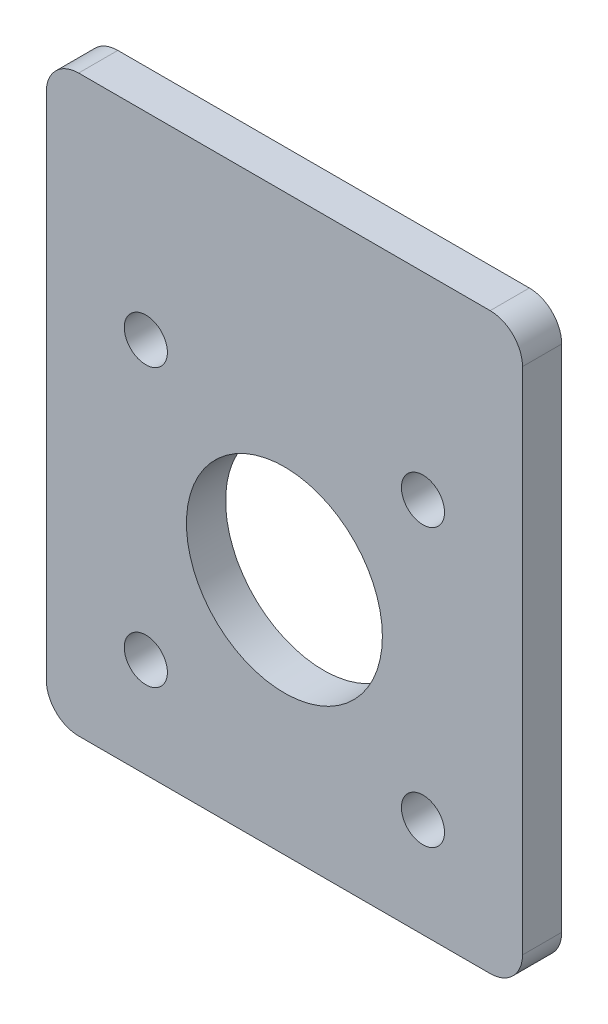
ISO-10303-21;
HEADER;
FILE_DESCRIPTION(('STEP AP214'),'2;1');
FILE_NAME('part.step','',(''),(''),'','','');
FILE_SCHEMA(('AUTOMOTIVE_DESIGN { 1 0 10303 214 1 1 1 1 }'));
ENDSEC;
DATA;
#1=APPLICATION_CONTEXT('core data for automotive mechanical design processes');
#2=APPLICATION_PROTOCOL_DEFINITION('international standard','automotive_design',2000,#1);
#3=PRODUCT_CONTEXT('',#1,'mechanical');
#4=PRODUCT('Part','Part','',(#3));
#5=PRODUCT_RELATED_PRODUCT_CATEGORY('part','',(#4));
#6=PRODUCT_DEFINITION_FORMATION('','',#4);
#7=PRODUCT_DEFINITION_CONTEXT('part definition',#1,'design');
#8=PRODUCT_DEFINITION('design','',#6,#7);
#9=PRODUCT_DEFINITION_SHAPE('','',#8);
#10=(LENGTH_UNIT() NAMED_UNIT(*) SI_UNIT(.MILLI.,.METRE.));
#11=(NAMED_UNIT(*) PLANE_ANGLE_UNIT() SI_UNIT($,.RADIAN.));
#12=(NAMED_UNIT(*) SI_UNIT($,.STERADIAN.) SOLID_ANGLE_UNIT());
#13=UNCERTAINTY_MEASURE_WITH_UNIT(LENGTH_MEASURE(1.E-05),#10,'distance_accuracy_value','');
#14=(GEOMETRIC_REPRESENTATION_CONTEXT(3) GLOBAL_UNCERTAINTY_ASSIGNED_CONTEXT((#13)) GLOBAL_UNIT_ASSIGNED_CONTEXT((#10,
#11,#12)) REPRESENTATION_CONTEXT('',''));
#15=CARTESIAN_POINT('',(0.,0.,0.));
#16=DIRECTION('',(0.,0.,1.));
#17=DIRECTION('',(1.,0.,0.));
#18=AXIS2_PLACEMENT_3D('',#15,#16,#17);
#19=CARTESIAN_POINT('',(-16.5432189845748,4.01167470132761,2.));
#20=DIRECTION('',(0.,0.,1.));
#21=DIRECTION('',(1.,0.,0.));
#22=AXIS2_PLACEMENT_3D('',#19,#20,#21);
#23=PLANE('',#22);
#24=CARTESIAN_POINT('',(-13.1142867964402,-4.41725748680701,2.));
#25=DIRECTION('',(0.,0.,1.));
#26=DIRECTION('',(1.,0.,0.));
#27=AXIS2_PLACEMENT_3D('',#24,#25,#26);
#28=CIRCLE('',#27,1.1);
#29=CARTESIAN_POINT('',(-12.0142867964402,-4.41725748680701,2.));
#30=VERTEX_POINT('',#29);
#31=EDGE_CURVE('E148',#30,#30,#28,.T.);
#32=ORIENTED_EDGE('',*,*,#31,.F.);
#33=EDGE_LOOP('',(#32));
#34=FACE_BOUND('',#33,.T.);
#35=CARTESIAN_POINT('',(1.02784882729082,-18.5593931105379,2.));
#36=DIRECTION('',(0.,0.,1.));
#37=DIRECTION('',(1.,0.,0.));
#38=AXIS2_PLACEMENT_3D('',#35,#36,#37);
#39=CIRCLE('',#38,1.1);
#40=CARTESIAN_POINT('',(2.12784882729082,-18.5593931105379,2.));
#41=VERTEX_POINT('',#40);
#42=EDGE_CURVE('E162',#41,#41,#39,.T.);
#43=ORIENTED_EDGE('',*,*,#42,.F.);
#44=EDGE_LOOP('',(#43));
#45=FACE_BOUND('',#44,.T.);
#46=CARTESIAN_POINT('',(1.02784882729071,-4.41725748680696,2.));
#47=DIRECTION('',(0.,0.,1.));
#48=DIRECTION('',(1.,0.,0.));
#49=AXIS2_PLACEMENT_3D('',#46,#47,#48);
#50=CIRCLE('',#49,1.1);
#51=CARTESIAN_POINT('',(2.12784882729071,-4.41725748680696,2.));
#52=VERTEX_POINT('',#51);
#53=EDGE_CURVE('E11',#52,#52,#50,.T.);
#54=ORIENTED_EDGE('',*,*,#53,.F.);
#55=EDGE_LOOP('',(#54));
#56=FACE_BOUND('',#55,.T.);
#57=CARTESIAN_POINT('',(-13.1142867964418,-18.5593931105363,2.));
#58=DIRECTION('',(0.,0.,1.));
#59=DIRECTION('',(1.,0.,0.));
#60=AXIS2_PLACEMENT_3D('',#57,#58,#59);
#61=CIRCLE('',#60,1.10000000000111);
#62=CARTESIAN_POINT('',(-12.0142867964407,-18.5593931105363,2.));
#63=VERTEX_POINT('',#62);
#64=EDGE_CURVE('E168',#63,#63,#61,.T.);
#65=ORIENTED_EDGE('',*,*,#64,.F.);
#66=EDGE_LOOP('',(#65));
#67=FACE_BOUND('',#66,.T.);
#68=CARTESIAN_POINT('',(-6.0432189845748,-11.4883252986724,2.));
#69=DIRECTION('',(0.,0.,1.));
#70=DIRECTION('',(1.,0.,0.));
#71=AXIS2_PLACEMENT_3D('',#68,#69,#70);
#72=CIRCLE('',#71,5.);
#73=CARTESIAN_POINT('',(-1.0432189845748,-11.4883252986724,2.));
#74=VERTEX_POINT('',#73);
#75=EDGE_CURVE('E156',#74,#74,#72,.T.);
#76=ORIENTED_EDGE('',*,*,#75,.F.);
#77=EDGE_LOOP('',(#76));
#78=FACE_BOUND('',#77,.T.);
#79=CARTESIAN_POINT('',(-16.5432189845748,4.01167470132761,2.));
#80=DIRECTION('',(0.,0.,1.));
#81=DIRECTION('',(1.,0.,0.));
#82=AXIS2_PLACEMENT_3D('',#79,#80,#81);
#83=CIRCLE('',#82,1.65);
#84=CARTESIAN_POINT('',(-16.5432189845748,5.66167470132761,2.));
#85=VERTEX_POINT('',#84);
#86=CARTESIAN_POINT('',(-18.1932189845748,4.01167470132761,2.));
#87=VERTEX_POINT('',#86);
#88=EDGE_CURVE('E118',#85,#87,#83,.T.);
#89=ORIENTED_EDGE('',*,*,#88,.T.);
#90=DIRECTION('',(0.,-1.,0.));
#91=VECTOR('',#90,1.);
#92=CARTESIAN_POINT('',(-18.1932189845748,4.01167470132761,2.));
#93=LINE('',#92,#91);
#94=CARTESIAN_POINT('',(-18.1932189845748,-21.9883252986724,2.));
#95=VERTEX_POINT('',#94);
#96=EDGE_CURVE('E48',#87,#95,#93,.T.);
#97=ORIENTED_EDGE('',*,*,#96,.T.);
#98=CARTESIAN_POINT('',(-16.5432189845748,-21.9883252986724,2.));
#99=DIRECTION('',(0.,0.,1.));
#100=DIRECTION('',(1.,0.,0.));
#101=AXIS2_PLACEMENT_3D('',#98,#99,#100);
#102=CIRCLE('',#101,1.65);
#103=CARTESIAN_POINT('',(-16.5432189845748,-23.6383252986724,2.));
#104=VERTEX_POINT('',#103);
#105=EDGE_CURVE('E108',#95,#104,#102,.T.);
#106=ORIENTED_EDGE('',*,*,#105,.T.);
#107=DIRECTION('',(1.,0.,0.));
#108=VECTOR('',#107,1.);
#109=CARTESIAN_POINT('',(-16.5432189845748,-23.6383252986724,2.));
#110=LINE('',#109,#108);
#111=CARTESIAN_POINT('',(4.45678101542519,-23.6383252986724,2.));
#112=VERTEX_POINT('',#111);
#113=EDGE_CURVE('E114',#104,#112,#110,.T.);
#114=ORIENTED_EDGE('',*,*,#113,.T.);
#115=CARTESIAN_POINT('',(4.45678101542519,-21.9883252986724,2.));
#116=DIRECTION('',(0.,0.,1.));
#117=DIRECTION('',(1.,0.,0.));
#118=AXIS2_PLACEMENT_3D('',#115,#116,#117);
#119=CIRCLE('',#118,1.65);
#120=CARTESIAN_POINT('',(6.10678101542519,-21.9883252986724,2.));
#121=VERTEX_POINT('',#120);
#122=EDGE_CURVE('E124',#112,#121,#119,.T.);
#123=ORIENTED_EDGE('',*,*,#122,.T.);
#124=DIRECTION('',(0.,1.,0.));
#125=VECTOR('',#124,1.);
#126=CARTESIAN_POINT('',(6.10678101542519,-21.9883252986724,2.));
#127=LINE('',#126,#125);
#128=CARTESIAN_POINT('',(6.10678101542518,4.01167470132761,2.));
#129=VERTEX_POINT('',#128);
#130=EDGE_CURVE('E127',#121,#129,#127,.T.);
#131=ORIENTED_EDGE('',*,*,#130,.T.);
#132=CARTESIAN_POINT('',(4.45678101542518,4.01167470132761,2.));
#133=DIRECTION('',(0.,0.,1.));
#134=DIRECTION('',(1.,0.,0.));
#135=AXIS2_PLACEMENT_3D('',#132,#133,#134);
#136=CIRCLE('',#135,1.65);
#137=CARTESIAN_POINT('',(4.45678101542518,5.66167470132761,2.));
#138=VERTEX_POINT('',#137);
#139=EDGE_CURVE('E130',#129,#138,#136,.T.);
#140=ORIENTED_EDGE('',*,*,#139,.T.);
#141=DIRECTION('',(-1.,0.,0.));
#142=VECTOR('',#141,1.);
#143=CARTESIAN_POINT('',(4.45678101542518,5.66167470132761,2.));
#144=LINE('',#143,#142);
#145=EDGE_CURVE('E133',#138,#85,#144,.T.);
#146=ORIENTED_EDGE('',*,*,#145,.T.);
#147=EDGE_LOOP('',(#89,#97,#106,#114,#123,#131,#140,#146));
#148=FACE_BOUND('',#147,.T.);
#149=ADVANCED_FACE('F33',(#34,#45,#56,#67,#78,#148),#23,.T.);
#150=CARTESIAN_POINT('',(-16.5432189845748,4.01167470132761,0.));
#151=DIRECTION('',(0.,0.,1.));
#152=DIRECTION('',(1.,0.,0.));
#153=AXIS2_PLACEMENT_3D('',#150,#151,#152);
#154=PLANE('',#153);
#155=CARTESIAN_POINT('',(-13.1142867964402,-4.41725748680701,0.));
#156=DIRECTION('',(0.,0.,1.));
#157=DIRECTION('',(1.,0.,0.));
#158=AXIS2_PLACEMENT_3D('',#155,#156,#157);
#159=CIRCLE('',#158,1.1);
#160=CARTESIAN_POINT('',(-12.0142867964402,-4.41725748680701,0.));
#161=VERTEX_POINT('',#160);
#162=EDGE_CURVE('E152',#161,#161,#159,.T.);
#163=ORIENTED_EDGE('',*,*,#162,.T.);
#164=EDGE_LOOP('',(#163));
#165=FACE_BOUND('',#164,.T.);
#166=CARTESIAN_POINT('',(-6.0432189845748,-11.4883252986724,0.));
#167=DIRECTION('',(0.,0.,1.));
#168=DIRECTION('',(1.,0.,0.));
#169=AXIS2_PLACEMENT_3D('',#166,#167,#168);
#170=CIRCLE('',#169,5.);
#171=CARTESIAN_POINT('',(-1.0432189845748,-11.4883252986724,0.));
#172=VERTEX_POINT('',#171);
#173=EDGE_CURVE('E151',#172,#172,#170,.T.);
#174=ORIENTED_EDGE('',*,*,#173,.T.);
#175=EDGE_LOOP('',(#174));
#176=FACE_BOUND('',#175,.T.);
#177=CARTESIAN_POINT('',(1.02784882729082,-18.5593931105379,0.));
#178=DIRECTION('',(0.,0.,1.));
#179=DIRECTION('',(1.,0.,0.));
#180=AXIS2_PLACEMENT_3D('',#177,#178,#179);
#181=CIRCLE('',#180,1.1);
#182=CARTESIAN_POINT('',(2.12784882729082,-18.5593931105379,0.));
#183=VERTEX_POINT('',#182);
#184=EDGE_CURVE('E159',#183,#183,#181,.T.);
#185=ORIENTED_EDGE('',*,*,#184,.T.);
#186=EDGE_LOOP('',(#185));
#187=FACE_BOUND('',#186,.T.);
#188=CARTESIAN_POINT('',(-13.1142867964418,-18.5593931105363,0.));
#189=DIRECTION('',(0.,0.,1.));
#190=DIRECTION('',(1.,0.,0.));
#191=AXIS2_PLACEMENT_3D('',#188,#189,#190);
#192=CIRCLE('',#191,1.10000000000111);
#193=CARTESIAN_POINT('',(-12.0142867964407,-18.5593931105363,0.));
#194=VERTEX_POINT('',#193);
#195=EDGE_CURVE('E165',#194,#194,#192,.T.);
#196=ORIENTED_EDGE('',*,*,#195,.T.);
#197=EDGE_LOOP('',(#196));
#198=FACE_BOUND('',#197,.T.);
#199=CARTESIAN_POINT('',(1.02784882729071,-4.41725748680696,0.));
#200=DIRECTION('',(0.,0.,1.));
#201=DIRECTION('',(1.,0.,0.));
#202=AXIS2_PLACEMENT_3D('',#199,#200,#201);
#203=CIRCLE('',#202,1.1);
#204=CARTESIAN_POINT('',(2.12784882729071,-4.41725748680696,0.));
#205=VERTEX_POINT('',#204);
#206=EDGE_CURVE('E37',#205,#205,#203,.T.);
#207=ORIENTED_EDGE('',*,*,#206,.T.);
#208=EDGE_LOOP('',(#207));
#209=FACE_BOUND('',#208,.T.);
#210=DIRECTION('',(0.,1.,0.));
#211=VECTOR('',#210,1.);
#212=CARTESIAN_POINT('',(-18.1932189845748,4.01167470132761,0.));
#213=LINE('',#212,#211);
#214=CARTESIAN_POINT('',(-18.1932189845748,-21.9883252986724,0.));
#215=VERTEX_POINT('',#214);
#216=CARTESIAN_POINT('',(-18.1932189845748,4.01167470132761,0.));
#217=VERTEX_POINT('',#216);
#218=EDGE_CURVE('E101',#215,#217,#213,.T.);
#219=ORIENTED_EDGE('',*,*,#218,.T.);
#220=CARTESIAN_POINT('',(-16.5432189845748,4.01167470132761,0.));
#221=DIRECTION('',(0.,0.,1.));
#222=DIRECTION('',(1.,0.,0.));
#223=AXIS2_PLACEMENT_3D('',#220,#221,#222);
#224=CIRCLE('',#223,1.65);
#225=CARTESIAN_POINT('',(-16.5432189845748,5.66167470132761,0.));
#226=VERTEX_POINT('',#225);
#227=EDGE_CURVE('E147',#217,#226,#224,.F.);
#228=ORIENTED_EDGE('',*,*,#227,.T.);
#229=DIRECTION('',(1.,0.,0.));
#230=VECTOR('',#229,1.);
#231=CARTESIAN_POINT('',(4.45678101542518,5.66167470132761,0.));
#232=LINE('',#231,#230);
#233=CARTESIAN_POINT('',(4.45678101542518,5.66167470132761,0.));
#234=VERTEX_POINT('',#233);
#235=EDGE_CURVE('E253',#226,#234,#232,.T.);
#236=ORIENTED_EDGE('',*,*,#235,.T.);
#237=CARTESIAN_POINT('',(4.45678101542518,4.01167470132761,0.));
#238=DIRECTION('',(0.,0.,1.));
#239=DIRECTION('',(1.,0.,0.));
#240=AXIS2_PLACEMENT_3D('',#237,#238,#239);
#241=CIRCLE('',#240,1.65);
#242=CARTESIAN_POINT('',(6.10678101542518,4.0116747013276,0.));
#243=VERTEX_POINT('',#242);
#244=EDGE_CURVE('E259',#234,#243,#241,.F.);
#245=ORIENTED_EDGE('',*,*,#244,.T.);
#246=DIRECTION('',(0.,-1.,0.));
#247=VECTOR('',#246,1.);
#248=CARTESIAN_POINT('',(6.10678101542519,-21.9883252986724,0.));
#249=LINE('',#248,#247);
#250=CARTESIAN_POINT('',(6.10678101542519,-21.9883252986724,0.));
#251=VERTEX_POINT('',#250);
#252=EDGE_CURVE('E263',#243,#251,#249,.T.);
#253=ORIENTED_EDGE('',*,*,#252,.T.);
#254=CARTESIAN_POINT('',(4.45678101542519,-21.9883252986724,0.));
#255=DIRECTION('',(0.,0.,1.));
#256=DIRECTION('',(1.,0.,0.));
#257=AXIS2_PLACEMENT_3D('',#254,#255,#256);
#258=CIRCLE('',#257,1.65);
#259=CARTESIAN_POINT('',(4.45678101542519,-23.6383252986724,0.));
#260=VERTEX_POINT('',#259);
#261=EDGE_CURVE('E267',#251,#260,#258,.F.);
#262=ORIENTED_EDGE('',*,*,#261,.T.);
#263=DIRECTION('',(-1.,0.,0.));
#264=VECTOR('',#263,1.);
#265=CARTESIAN_POINT('',(-16.5432189845748,-23.6383252986724,0.));
#266=LINE('',#265,#264);
#267=CARTESIAN_POINT('',(-16.5432189845748,-23.6383252986724,0.));
#268=VERTEX_POINT('',#267);
#269=EDGE_CURVE('E270',#260,#268,#266,.T.);
#270=ORIENTED_EDGE('',*,*,#269,.T.);
#271=CARTESIAN_POINT('',(-16.5432189845748,-21.9883252986724,0.));
#272=DIRECTION('',(0.,0.,1.));
#273=DIRECTION('',(1.,0.,0.));
#274=AXIS2_PLACEMENT_3D('',#271,#272,#273);
#275=CIRCLE('',#274,1.65);
#276=EDGE_CURVE('E155',#268,#215,#275,.F.);
#277=ORIENTED_EDGE('',*,*,#276,.T.);
#278=EDGE_LOOP('',(#219,#228,#236,#245,#253,#262,#270,#277));
#279=FACE_BOUND('',#278,.T.);
#280=ADVANCED_FACE('F35',(#165,#176,#187,#198,#209,#279),#154,.F.);
#281=CARTESIAN_POINT('',(1.02784882729071,-4.41725748680696,2.));
#282=DIRECTION('',(0.,0.,-1.));
#283=DIRECTION('',(-1.,0.,0.));
#284=AXIS2_PLACEMENT_3D('',#281,#282,#283);
#285=CYLINDRICAL_SURFACE('',#284,1.1);
#286=ORIENTED_EDGE('',*,*,#53,.T.);
#287=EDGE_LOOP('',(#286));
#288=FACE_BOUND('',#287,.T.);
#289=ORIENTED_EDGE('',*,*,#206,.F.);
#290=EDGE_LOOP('',(#289));
#291=FACE_BOUND('',#290,.T.);
#292=ADVANCED_FACE('F179',(#288,#291),#285,.F.);
#293=CARTESIAN_POINT('',(-13.1142867964418,-18.5593931105363,2.));
#294=DIRECTION('',(0.,0.,-1.));
#295=DIRECTION('',(-1.,0.,0.));
#296=AXIS2_PLACEMENT_3D('',#293,#294,#295);
#297=CYLINDRICAL_SURFACE('',#296,1.10000000000111);
#298=ORIENTED_EDGE('',*,*,#64,.T.);
#299=EDGE_LOOP('',(#298));
#300=FACE_BOUND('',#299,.T.);
#301=ORIENTED_EDGE('',*,*,#195,.F.);
#302=EDGE_LOOP('',(#301));
#303=FACE_BOUND('',#302,.T.);
#304=ADVANCED_FACE('F176',(#300,#303),#297,.F.);
#305=CARTESIAN_POINT('',(1.02784882729082,-18.5593931105379,2.));
#306=DIRECTION('',(0.,0.,-1.));
#307=DIRECTION('',(-1.,0.,0.));
#308=AXIS2_PLACEMENT_3D('',#305,#306,#307);
#309=CYLINDRICAL_SURFACE('',#308,1.1);
#310=ORIENTED_EDGE('',*,*,#42,.T.);
#311=EDGE_LOOP('',(#310));
#312=FACE_BOUND('',#311,.T.);
#313=ORIENTED_EDGE('',*,*,#184,.F.);
#314=EDGE_LOOP('',(#313));
#315=FACE_BOUND('',#314,.T.);
#316=ADVANCED_FACE('F178',(#312,#315),#309,.F.);
#317=CARTESIAN_POINT('',(-6.0432189845748,-11.4883252986724,2.));
#318=DIRECTION('',(0.,0.,-1.));
#319=DIRECTION('',(-1.,0.,0.));
#320=AXIS2_PLACEMENT_3D('',#317,#318,#319);
#321=CYLINDRICAL_SURFACE('',#320,5.);
#322=ORIENTED_EDGE('',*,*,#75,.T.);
#323=EDGE_LOOP('',(#322));
#324=FACE_BOUND('',#323,.T.);
#325=ORIENTED_EDGE('',*,*,#173,.F.);
#326=EDGE_LOOP('',(#325));
#327=FACE_BOUND('',#326,.T.);
#328=ADVANCED_FACE('F186',(#324,#327),#321,.F.);
#329=CARTESIAN_POINT('',(-13.1142867964402,-4.41725748680701,2.));
#330=DIRECTION('',(0.,0.,-1.));
#331=DIRECTION('',(-1.,0.,0.));
#332=AXIS2_PLACEMENT_3D('',#329,#330,#331);
#333=CYLINDRICAL_SURFACE('',#332,1.1);
#334=ORIENTED_EDGE('',*,*,#31,.T.);
#335=EDGE_LOOP('',(#334));
#336=FACE_BOUND('',#335,.T.);
#337=ORIENTED_EDGE('',*,*,#162,.F.);
#338=EDGE_LOOP('',(#337));
#339=FACE_BOUND('',#338,.T.);
#340=ADVANCED_FACE('F209',(#336,#339),#333,.F.);
#341=CARTESIAN_POINT('',(-18.1932189845748,4.01167470132761,-39.0512483795333));
#342=DIRECTION('',(-1.,0.,0.));
#343=DIRECTION('',(0.,0.,1.));
#344=AXIS2_PLACEMENT_3D('',#341,#342,#343);
#345=PLANE('',#344);
#346=DIRECTION('',(0.,0.,1.));
#347=VECTOR('',#346,1.);
#348=CARTESIAN_POINT('',(-18.1932189845748,-21.9883252986724,-39.0512483795333));
#349=LINE('',#348,#347);
#350=EDGE_CURVE('E97',#215,#95,#349,.T.);
#351=ORIENTED_EDGE('',*,*,#350,.T.);
#352=ORIENTED_EDGE('',*,*,#96,.F.);
#353=DIRECTION('',(0.,0.,1.));
#354=VECTOR('',#353,1.);
#355=CARTESIAN_POINT('',(-18.1932189845748,4.01167470132761,-39.0512483795333));
#356=LINE('',#355,#354);
#357=EDGE_CURVE('E105',#217,#87,#356,.T.);
#358=ORIENTED_EDGE('',*,*,#357,.F.);
#359=ORIENTED_EDGE('',*,*,#218,.F.);
#360=EDGE_LOOP('',(#351,#352,#358,#359));
#361=FACE_BOUND('',#360,.T.);
#362=ADVANCED_FACE('F99',(#361),#345,.T.);
#363=CARTESIAN_POINT('',(-16.5432189845748,-21.9883252986724,-39.0512483795333));
#364=DIRECTION('',(0.,0.,1.));
#365=DIRECTION('',(1.,0.,0.));
#366=AXIS2_PLACEMENT_3D('',#363,#364,#365);
#367=CYLINDRICAL_SURFACE('',#366,1.65);
#368=DIRECTION('',(0.,0.,1.));
#369=VECTOR('',#368,1.);
#370=CARTESIAN_POINT('',(-16.5432189845748,-23.6383252986724,-39.0512483795333));
#371=LINE('',#370,#369);
#372=EDGE_CURVE('E104',#268,#104,#371,.T.);
#373=ORIENTED_EDGE('',*,*,#372,.T.);
#374=ORIENTED_EDGE('',*,*,#105,.F.);
#375=ORIENTED_EDGE('',*,*,#350,.F.);
#376=ORIENTED_EDGE('',*,*,#276,.F.);
#377=EDGE_LOOP('',(#373,#374,#375,#376));
#378=FACE_BOUND('',#377,.T.);
#379=ADVANCED_FACE('F109',(#378),#367,.T.);
#380=CARTESIAN_POINT('',(-16.5432189845748,-23.6383252986724,-39.0512483795333));
#381=DIRECTION('',(0.,-1.,0.));
#382=DIRECTION('',(1.,0.,0.));
#383=AXIS2_PLACEMENT_3D('',#380,#381,#382);
#384=PLANE('',#383);
#385=DIRECTION('',(0.,0.,1.));
#386=VECTOR('',#385,1.);
#387=CARTESIAN_POINT('',(4.45678101542519,-23.6383252986724,-39.0512483795333));
#388=LINE('',#387,#386);
#389=EDGE_CURVE('E142',#260,#112,#388,.T.);
#390=ORIENTED_EDGE('',*,*,#389,.T.);
#391=ORIENTED_EDGE('',*,*,#113,.F.);
#392=ORIENTED_EDGE('',*,*,#372,.F.);
#393=ORIENTED_EDGE('',*,*,#269,.F.);
#394=EDGE_LOOP('',(#390,#391,#392,#393));
#395=FACE_BOUND('',#394,.T.);
#396=ADVANCED_FACE('F230',(#395),#384,.T.);
#397=CARTESIAN_POINT('',(4.45678101542519,-21.9883252986724,-39.0512483795333));
#398=DIRECTION('',(0.,0.,1.));
#399=DIRECTION('',(1.,0.,0.));
#400=AXIS2_PLACEMENT_3D('',#397,#398,#399);
#401=CYLINDRICAL_SURFACE('',#400,1.65);
#402=DIRECTION('',(0.,0.,1.));
#403=VECTOR('',#402,1.);
#404=CARTESIAN_POINT('',(6.10678101542519,-21.9883252986724,-39.0512483795333));
#405=LINE('',#404,#403);
#406=EDGE_CURVE('E140',#251,#121,#405,.T.);
#407=ORIENTED_EDGE('',*,*,#406,.T.);
#408=ORIENTED_EDGE('',*,*,#122,.F.);
#409=ORIENTED_EDGE('',*,*,#389,.F.);
#410=ORIENTED_EDGE('',*,*,#261,.F.);
#411=EDGE_LOOP('',(#407,#408,#409,#410));
#412=FACE_BOUND('',#411,.T.);
#413=ADVANCED_FACE('F233',(#412),#401,.T.);
#414=CARTESIAN_POINT('',(6.10678101542519,-21.9883252986724,-39.0512483795333));
#415=DIRECTION('',(1.,0.,0.));
#416=DIRECTION('',(0.,1.,0.));
#417=AXIS2_PLACEMENT_3D('',#414,#415,#416);
#418=PLANE('',#417);
#419=DIRECTION('',(0.,0.,1.));
#420=VECTOR('',#419,1.);
#421=CARTESIAN_POINT('',(6.10678101542518,4.01167470132761,-39.0512483795333));
#422=LINE('',#421,#420);
#423=EDGE_CURVE('E138',#243,#129,#422,.T.);
#424=ORIENTED_EDGE('',*,*,#423,.T.);
#425=ORIENTED_EDGE('',*,*,#130,.F.);
#426=ORIENTED_EDGE('',*,*,#406,.F.);
#427=ORIENTED_EDGE('',*,*,#252,.F.);
#428=EDGE_LOOP('',(#424,#425,#426,#427));
#429=FACE_BOUND('',#428,.T.);
#430=ADVANCED_FACE('F237',(#429),#418,.T.);
#431=CARTESIAN_POINT('',(4.45678101542518,4.01167470132761,-39.0512483795333));
#432=DIRECTION('',(0.,0.,1.));
#433=DIRECTION('',(1.,0.,0.));
#434=AXIS2_PLACEMENT_3D('',#431,#432,#433);
#435=CYLINDRICAL_SURFACE('',#434,1.65);
#436=DIRECTION('',(0.,0.,1.));
#437=VECTOR('',#436,1.);
#438=CARTESIAN_POINT('',(4.45678101542518,5.66167470132761,-39.0512483795333));
#439=LINE('',#438,#437);
#440=EDGE_CURVE('E136',#234,#138,#439,.T.);
#441=ORIENTED_EDGE('',*,*,#440,.T.);
#442=ORIENTED_EDGE('',*,*,#139,.F.);
#443=ORIENTED_EDGE('',*,*,#423,.F.);
#444=ORIENTED_EDGE('',*,*,#244,.F.);
#445=EDGE_LOOP('',(#441,#442,#443,#444));
#446=FACE_BOUND('',#445,.T.);
#447=ADVANCED_FACE('F241',(#446),#435,.T.);
#448=CARTESIAN_POINT('',(4.45678101542518,5.66167470132761,-39.0512483795333));
#449=DIRECTION('',(0.,1.,0.));
#450=DIRECTION('',(0.,0.,1.));
#451=AXIS2_PLACEMENT_3D('',#448,#449,#450);
#452=PLANE('',#451);
#453=DIRECTION('',(0.,0.,1.));
#454=VECTOR('',#453,1.);
#455=CARTESIAN_POINT('',(-16.5432189845748,5.66167470132761,-39.0512483795333));
#456=LINE('',#455,#454);
#457=EDGE_CURVE('E56',#226,#85,#456,.T.);
#458=ORIENTED_EDGE('',*,*,#457,.T.);
#459=ORIENTED_EDGE('',*,*,#145,.F.);
#460=ORIENTED_EDGE('',*,*,#440,.F.);
#461=ORIENTED_EDGE('',*,*,#235,.F.);
#462=EDGE_LOOP('',(#458,#459,#460,#461));
#463=FACE_BOUND('',#462,.T.);
#464=ADVANCED_FACE('F225',(#463),#452,.T.);
#465=CARTESIAN_POINT('',(-16.5432189845748,4.01167470132761,-39.0512483795333));
#466=DIRECTION('',(0.,0.,1.));
#467=DIRECTION('',(1.,0.,0.));
#468=AXIS2_PLACEMENT_3D('',#465,#466,#467);
#469=CYLINDRICAL_SURFACE('',#468,1.65);
#470=ORIENTED_EDGE('',*,*,#357,.T.);
#471=ORIENTED_EDGE('',*,*,#88,.F.);
#472=ORIENTED_EDGE('',*,*,#457,.F.);
#473=ORIENTED_EDGE('',*,*,#227,.F.);
#474=EDGE_LOOP('',(#470,#471,#472,#473));
#475=FACE_BOUND('',#474,.T.);
#476=ADVANCED_FACE('F222',(#475),#469,.T.);
#477=CLOSED_SHELL('',(#149,#280,#292,#304,#316,#328,#340,#362,#379,#396,#413,#430,#447,#464,#476));
#478=MANIFOLD_SOLID_BREP('B2',#477);
#479=ADVANCED_BREP_SHAPE_REPRESENTATION('',(#18,#478),#14);
#480=SHAPE_DEFINITION_REPRESENTATION(#9,#479);
ENDSEC;
END-ISO-10303-21;
